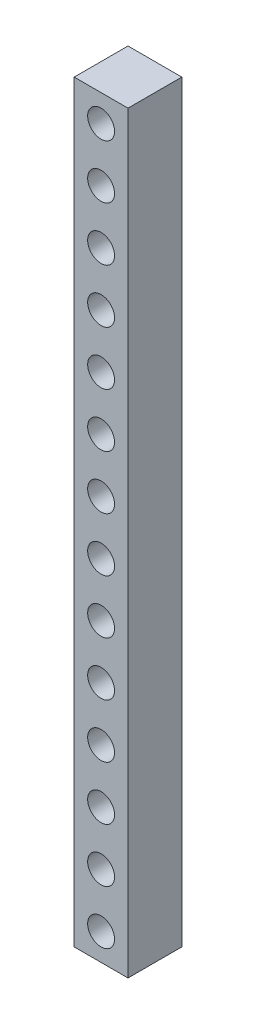
ISO-10303-21;
HEADER;
FILE_DESCRIPTION(('STEP AP214'),'2;1');
FILE_NAME('part.step','',(''),(''),'','','');
FILE_SCHEMA(('AUTOMOTIVE_DESIGN { 1 0 10303 214 1 1 1 1 }'));
ENDSEC;
DATA;
#1=APPLICATION_CONTEXT('core data for automotive mechanical design processes');
#2=APPLICATION_PROTOCOL_DEFINITION('international standard','automotive_design',2000,#1);
#3=PRODUCT_CONTEXT('',#1,'mechanical');
#4=PRODUCT('Part','Part','',(#3));
#5=PRODUCT_RELATED_PRODUCT_CATEGORY('part','',(#4));
#6=PRODUCT_DEFINITION_FORMATION('','',#4);
#7=PRODUCT_DEFINITION_CONTEXT('part definition',#1,'design');
#8=PRODUCT_DEFINITION('design','',#6,#7);
#9=PRODUCT_DEFINITION_SHAPE('','',#8);
#10=(LENGTH_UNIT() NAMED_UNIT(*) SI_UNIT(.MILLI.,.METRE.));
#11=(NAMED_UNIT(*) PLANE_ANGLE_UNIT() SI_UNIT($,.RADIAN.));
#12=(NAMED_UNIT(*) SI_UNIT($,.STERADIAN.) SOLID_ANGLE_UNIT());
#13=UNCERTAINTY_MEASURE_WITH_UNIT(LENGTH_MEASURE(1.E-05),#10,'distance_accuracy_value','');
#14=(GEOMETRIC_REPRESENTATION_CONTEXT(3) GLOBAL_UNCERTAINTY_ASSIGNED_CONTEXT((#13)) GLOBAL_UNIT_ASSIGNED_CONTEXT((#10,
#11,#12)) REPRESENTATION_CONTEXT('',''));
#15=CARTESIAN_POINT('',(0.,0.,0.));
#16=DIRECTION('',(0.,0.,1.));
#17=DIRECTION('',(1.,0.,0.));
#18=AXIS2_PLACEMENT_3D('',#15,#16,#17);
#19=CARTESIAN_POINT('',(0.,0.,10.));
#20=DIRECTION('',(0.,0.,-1.));
#21=DIRECTION('',(-1.,0.,0.));
#22=AXIS2_PLACEMENT_3D('',#19,#20,#21);
#23=PLANE('',#22);
#24=DIRECTION('',(0.,-1.,0.));
#25=VECTOR('',#24,1.);
#26=CARTESIAN_POINT('',(-5.,69.9999999999998,10.));
#27=LINE('',#26,#25);
#28=CARTESIAN_POINT('',(-5.,69.9999999999998,10.));
#29=VERTEX_POINT('',#28);
#30=CARTESIAN_POINT('',(-5.00000000000004,-70.0000000000002,10.));
#31=VERTEX_POINT('',#30);
#32=EDGE_CURVE('E85',#29,#31,#27,.T.);
#33=ORIENTED_EDGE('',*,*,#32,.T.);
#34=DIRECTION('',(1.,0.,0.));
#35=VECTOR('',#34,1.);
#36=CARTESIAN_POINT('',(5.00000000000008,-70.0000000000002,10.));
#37=LINE('',#36,#35);
#38=CARTESIAN_POINT('',(5.00000000000008,-70.0000000000002,10.));
#39=VERTEX_POINT('',#38);
#40=EDGE_CURVE('E80',#31,#39,#37,.T.);
#41=ORIENTED_EDGE('',*,*,#40,.T.);
#42=DIRECTION('',(0.,1.,0.));
#43=VECTOR('',#42,1.);
#44=CARTESIAN_POINT('',(5.,69.9999999999998,10.));
#45=LINE('',#44,#43);
#46=CARTESIAN_POINT('',(5.,69.9999999999998,10.));
#47=VERTEX_POINT('',#46);
#48=EDGE_CURVE('E83',#39,#47,#45,.T.);
#49=ORIENTED_EDGE('',*,*,#48,.T.);
#50=DIRECTION('',(-1.,0.,0.));
#51=VECTOR('',#50,1.);
#52=CARTESIAN_POINT('',(5.,69.9999999999998,10.));
#53=LINE('',#52,#51);
#54=EDGE_CURVE('E50',#47,#29,#53,.T.);
#55=ORIENTED_EDGE('',*,*,#54,.T.);
#56=EDGE_LOOP('',(#33,#41,#49,#55));
#57=FACE_BOUND('',#56,.T.);
#58=CARTESIAN_POINT('',(0.,64.9999999999998,10.));
#59=DIRECTION('',(0.,0.,1.));
#60=DIRECTION('',(1.,0.,0.));
#61=AXIS2_PLACEMENT_3D('',#58,#59,#60);
#62=CIRCLE('',#61,2.5);
#63=CARTESIAN_POINT('',(2.50000000000001,64.9999999999998,10.));
#64=VERTEX_POINT('',#63);
#65=EDGE_CURVE('E100',#64,#64,#62,.T.);
#66=ORIENTED_EDGE('',*,*,#65,.F.);
#67=EDGE_LOOP('',(#66));
#68=FACE_BOUND('',#67,.T.);
#69=CARTESIAN_POINT('',(1.09081248855236E-13,54.9999999999998,10.));
#70=DIRECTION('',(0.,0.,1.));
#71=DIRECTION('',(1.,0.,0.));
#72=AXIS2_PLACEMENT_3D('',#69,#70,#71);
#73=CIRCLE('',#72,2.5);
#74=CARTESIAN_POINT('',(2.50000000000011,54.9999999999998,10.));
#75=VERTEX_POINT('',#74);
#76=EDGE_CURVE('E115',#75,#75,#73,.T.);
#77=ORIENTED_EDGE('',*,*,#76,.F.);
#78=EDGE_LOOP('',(#77));
#79=FACE_BOUND('',#78,.T.);
#80=CARTESIAN_POINT('',(2.1382568902053E-13,44.9999999999998,10.));
#81=DIRECTION('',(0.,0.,1.));
#82=DIRECTION('',(1.,0.,0.));
#83=AXIS2_PLACEMENT_3D('',#80,#81,#82);
#84=CIRCLE('',#83,2.5);
#85=CARTESIAN_POINT('',(2.50000000000022,44.9999999999998,10.));
#86=VERTEX_POINT('',#85);
#87=EDGE_CURVE('E121',#86,#86,#84,.T.);
#88=ORIENTED_EDGE('',*,*,#87,.F.);
#89=EDGE_LOOP('',(#88));
#90=FACE_BOUND('',#89,.T.);
#91=CARTESIAN_POINT('',(3.18570129185824E-13,34.9999999999998,10.));
#92=DIRECTION('',(0.,0.,1.));
#93=DIRECTION('',(1.,0.,0.));
#94=AXIS2_PLACEMENT_3D('',#91,#92,#93);
#95=CIRCLE('',#94,2.5);
#96=CARTESIAN_POINT('',(2.50000000000032,34.9999999999998,10.));
#97=VERTEX_POINT('',#96);
#98=EDGE_CURVE('E127',#97,#97,#95,.T.);
#99=ORIENTED_EDGE('',*,*,#98,.F.);
#100=EDGE_LOOP('',(#99));
#101=FACE_BOUND('',#100,.T.);
#102=CARTESIAN_POINT('',(4.23314569351118E-13,24.9999999999998,10.));
#103=DIRECTION('',(0.,0.,1.));
#104=DIRECTION('',(1.,0.,0.));
#105=AXIS2_PLACEMENT_3D('',#102,#103,#104);
#106=CIRCLE('',#105,2.5);
#107=CARTESIAN_POINT('',(2.50000000000042,24.9999999999998,10.));
#108=VERTEX_POINT('',#107);
#109=EDGE_CURVE('E133',#108,#108,#106,.T.);
#110=ORIENTED_EDGE('',*,*,#109,.F.);
#111=EDGE_LOOP('',(#110));
#112=FACE_BOUND('',#111,.T.);
#113=CARTESIAN_POINT('',(5.28059009516412E-13,14.9999999999998,10.));
#114=DIRECTION('',(0.,0.,1.));
#115=DIRECTION('',(1.,0.,0.));
#116=AXIS2_PLACEMENT_3D('',#113,#114,#115);
#117=CIRCLE('',#116,2.5);
#118=CARTESIAN_POINT('',(2.50000000000053,14.9999999999998,10.));
#119=VERTEX_POINT('',#118);
#120=EDGE_CURVE('E139',#119,#119,#117,.T.);
#121=ORIENTED_EDGE('',*,*,#120,.F.);
#122=EDGE_LOOP('',(#121));
#123=FACE_BOUND('',#122,.T.);
#124=CARTESIAN_POINT('',(6.32803449681706E-13,4.99999999999985,10.));
#125=DIRECTION('',(0.,0.,1.));
#126=DIRECTION('',(1.,0.,0.));
#127=AXIS2_PLACEMENT_3D('',#124,#125,#126);
#128=CIRCLE('',#127,2.5);
#129=CARTESIAN_POINT('',(2.50000000000063,4.99999999999985,10.));
#130=VERTEX_POINT('',#129);
#131=EDGE_CURVE('E145',#130,#130,#128,.T.);
#132=ORIENTED_EDGE('',*,*,#131,.F.);
#133=EDGE_LOOP('',(#132));
#134=FACE_BOUND('',#133,.T.);
#135=CARTESIAN_POINT('',(7.37547889847E-13,-5.00000000000014,10.));
#136=DIRECTION('',(0.,0.,1.));
#137=DIRECTION('',(1.,0.,0.));
#138=AXIS2_PLACEMENT_3D('',#135,#136,#137);
#139=CIRCLE('',#138,2.5);
#140=CARTESIAN_POINT('',(2.50000000000074,-5.00000000000014,10.));
#141=VERTEX_POINT('',#140);
#142=EDGE_CURVE('E151',#141,#141,#139,.T.);
#143=ORIENTED_EDGE('',*,*,#142,.F.);
#144=EDGE_LOOP('',(#143));
#145=FACE_BOUND('',#144,.T.);
#146=CARTESIAN_POINT('',(8.42292330012294E-13,-15.0000000000001,10.));
#147=DIRECTION('',(0.,0.,1.));
#148=DIRECTION('',(1.,0.,0.));
#149=AXIS2_PLACEMENT_3D('',#146,#147,#148);
#150=CIRCLE('',#149,2.5);
#151=CARTESIAN_POINT('',(2.50000000000084,-15.0000000000001,10.));
#152=VERTEX_POINT('',#151);
#153=EDGE_CURVE('E157',#152,#152,#150,.T.);
#154=ORIENTED_EDGE('',*,*,#153,.F.);
#155=EDGE_LOOP('',(#154));
#156=FACE_BOUND('',#155,.T.);
#157=CARTESIAN_POINT('',(9.47036770177587E-13,-25.0000000000001,10.));
#158=DIRECTION('',(0.,0.,1.));
#159=DIRECTION('',(1.,0.,0.));
#160=AXIS2_PLACEMENT_3D('',#157,#158,#159);
#161=CIRCLE('',#160,2.5);
#162=CARTESIAN_POINT('',(2.50000000000095,-25.0000000000001,10.));
#163=VERTEX_POINT('',#162);
#164=EDGE_CURVE('E163',#163,#163,#161,.T.);
#165=ORIENTED_EDGE('',*,*,#164,.F.);
#166=EDGE_LOOP('',(#165));
#167=FACE_BOUND('',#166,.T.);
#168=CARTESIAN_POINT('',(1.05178121034288E-12,-35.0000000000001,10.));
#169=DIRECTION('',(0.,0.,1.));
#170=DIRECTION('',(1.,0.,0.));
#171=AXIS2_PLACEMENT_3D('',#168,#169,#170);
#172=CIRCLE('',#171,2.5);
#173=CARTESIAN_POINT('',(2.50000000000105,-35.0000000000001,10.));
#174=VERTEX_POINT('',#173);
#175=EDGE_CURVE('E169',#174,#174,#172,.T.);
#176=ORIENTED_EDGE('',*,*,#175,.F.);
#177=EDGE_LOOP('',(#176));
#178=FACE_BOUND('',#177,.T.);
#179=CARTESIAN_POINT('',(1.15652565050818E-12,-45.0000000000001,10.));
#180=DIRECTION('',(0.,0.,1.));
#181=DIRECTION('',(1.,0.,0.));
#182=AXIS2_PLACEMENT_3D('',#179,#180,#181);
#183=CIRCLE('',#182,2.5);
#184=CARTESIAN_POINT('',(2.50000000000116,-45.0000000000001,10.));
#185=VERTEX_POINT('',#184);
#186=EDGE_CURVE('E175',#185,#185,#183,.T.);
#187=ORIENTED_EDGE('',*,*,#186,.F.);
#188=EDGE_LOOP('',(#187));
#189=FACE_BOUND('',#188,.T.);
#190=CARTESIAN_POINT('',(1.26127009067347E-12,-55.0000000000001,10.));
#191=DIRECTION('',(0.,0.,1.));
#192=DIRECTION('',(1.,0.,0.));
#193=AXIS2_PLACEMENT_3D('',#190,#191,#192);
#194=CIRCLE('',#193,2.5);
#195=CARTESIAN_POINT('',(2.50000000000126,-55.0000000000001,10.));
#196=VERTEX_POINT('',#195);
#197=EDGE_CURVE('E181',#196,#196,#194,.T.);
#198=ORIENTED_EDGE('',*,*,#197,.F.);
#199=EDGE_LOOP('',(#198));
#200=FACE_BOUND('',#199,.T.);
#201=CARTESIAN_POINT('',(1.36601453083876E-12,-65.0000000000001,10.));
#202=DIRECTION('',(0.,0.,1.));
#203=DIRECTION('',(1.,0.,0.));
#204=AXIS2_PLACEMENT_3D('',#201,#202,#203);
#205=CIRCLE('',#204,2.5);
#206=CARTESIAN_POINT('',(2.50000000000137,-65.0000000000001,10.));
#207=VERTEX_POINT('',#206);
#208=EDGE_CURVE('E187',#207,#207,#205,.T.);
#209=ORIENTED_EDGE('',*,*,#208,.F.);
#210=EDGE_LOOP('',(#209));
#211=FACE_BOUND('',#210,.T.);
#212=ADVANCED_FACE('F33',(#57,#68,#79,#90,#101,#112,#123,#134,#145,#156,#167,#178,#189,#200,
#211),#23,.F.);
#213=CARTESIAN_POINT('',(0.,0.,0.));
#214=DIRECTION('',(0.,0.,-1.));
#215=DIRECTION('',(-1.,0.,0.));
#216=AXIS2_PLACEMENT_3D('',#213,#214,#215);
#217=PLANE('',#216);
#218=CARTESIAN_POINT('',(1.26127009067347E-12,-55.0000000000001,0.));
#219=DIRECTION('',(0.,0.,1.));
#220=DIRECTION('',(1.,0.,0.));
#221=AXIS2_PLACEMENT_3D('',#218,#219,#220);
#222=CIRCLE('',#221,2.5);
#223=CARTESIAN_POINT('',(2.50000000000126,-55.0000000000001,0.));
#224=VERTEX_POINT('',#223);
#225=EDGE_CURVE('E184',#224,#224,#222,.T.);
#226=ORIENTED_EDGE('',*,*,#225,.T.);
#227=EDGE_LOOP('',(#226));
#228=FACE_BOUND('',#227,.T.);
#229=CARTESIAN_POINT('',(1.05178121034288E-12,-35.0000000000001,0.));
#230=DIRECTION('',(0.,0.,1.));
#231=DIRECTION('',(1.,0.,0.));
#232=AXIS2_PLACEMENT_3D('',#229,#230,#231);
#233=CIRCLE('',#232,2.5);
#234=CARTESIAN_POINT('',(2.50000000000105,-35.0000000000001,0.));
#235=VERTEX_POINT('',#234);
#236=EDGE_CURVE('E172',#235,#235,#233,.T.);
#237=ORIENTED_EDGE('',*,*,#236,.T.);
#238=EDGE_LOOP('',(#237));
#239=FACE_BOUND('',#238,.T.);
#240=CARTESIAN_POINT('',(8.42292330012294E-13,-15.0000000000001,0.));
#241=DIRECTION('',(0.,0.,1.));
#242=DIRECTION('',(1.,0.,0.));
#243=AXIS2_PLACEMENT_3D('',#240,#241,#242);
#244=CIRCLE('',#243,2.5);
#245=CARTESIAN_POINT('',(2.50000000000084,-15.0000000000001,0.));
#246=VERTEX_POINT('',#245);
#247=EDGE_CURVE('E160',#246,#246,#244,.T.);
#248=ORIENTED_EDGE('',*,*,#247,.T.);
#249=EDGE_LOOP('',(#248));
#250=FACE_BOUND('',#249,.T.);
#251=CARTESIAN_POINT('',(6.32803449681706E-13,4.99999999999985,0.));
#252=DIRECTION('',(0.,0.,1.));
#253=DIRECTION('',(1.,0.,0.));
#254=AXIS2_PLACEMENT_3D('',#251,#252,#253);
#255=CIRCLE('',#254,2.5);
#256=CARTESIAN_POINT('',(2.50000000000063,4.99999999999985,0.));
#257=VERTEX_POINT('',#256);
#258=EDGE_CURVE('E148',#257,#257,#255,.T.);
#259=ORIENTED_EDGE('',*,*,#258,.T.);
#260=EDGE_LOOP('',(#259));
#261=FACE_BOUND('',#260,.T.);
#262=CARTESIAN_POINT('',(4.23314569351118E-13,24.9999999999998,0.));
#263=DIRECTION('',(0.,0.,1.));
#264=DIRECTION('',(1.,0.,0.));
#265=AXIS2_PLACEMENT_3D('',#262,#263,#264);
#266=CIRCLE('',#265,2.5);
#267=CARTESIAN_POINT('',(2.50000000000042,24.9999999999998,0.));
#268=VERTEX_POINT('',#267);
#269=EDGE_CURVE('E136',#268,#268,#266,.T.);
#270=ORIENTED_EDGE('',*,*,#269,.T.);
#271=EDGE_LOOP('',(#270));
#272=FACE_BOUND('',#271,.T.);
#273=CARTESIAN_POINT('',(2.1382568902053E-13,44.9999999999998,0.));
#274=DIRECTION('',(0.,0.,1.));
#275=DIRECTION('',(1.,0.,0.));
#276=AXIS2_PLACEMENT_3D('',#273,#274,#275);
#277=CIRCLE('',#276,2.5);
#278=CARTESIAN_POINT('',(2.50000000000022,44.9999999999998,0.));
#279=VERTEX_POINT('',#278);
#280=EDGE_CURVE('E124',#279,#279,#277,.T.);
#281=ORIENTED_EDGE('',*,*,#280,.T.);
#282=EDGE_LOOP('',(#281));
#283=FACE_BOUND('',#282,.T.);
#284=CARTESIAN_POINT('',(0.,64.9999999999998,0.));
#285=DIRECTION('',(0.,0.,1.));
#286=DIRECTION('',(1.,0.,0.));
#287=AXIS2_PLACEMENT_3D('',#284,#285,#286);
#288=CIRCLE('',#287,2.5);
#289=CARTESIAN_POINT('',(2.50000000000001,64.9999999999998,0.));
#290=VERTEX_POINT('',#289);
#291=EDGE_CURVE('E112',#290,#290,#288,.T.);
#292=ORIENTED_EDGE('',*,*,#291,.T.);
#293=EDGE_LOOP('',(#292));
#294=FACE_BOUND('',#293,.T.);
#295=DIRECTION('',(0.,-1.,0.));
#296=VECTOR('',#295,1.);
#297=CARTESIAN_POINT('',(-5.,69.9999999999998,0.));
#298=LINE('',#297,#296);
#299=CARTESIAN_POINT('',(-5.,69.9999999999998,0.));
#300=VERTEX_POINT('',#299);
#301=CARTESIAN_POINT('',(-5.00000000000004,-70.0000000000002,0.));
#302=VERTEX_POINT('',#301);
#303=EDGE_CURVE('E97',#300,#302,#298,.T.);
#304=ORIENTED_EDGE('',*,*,#303,.F.);
#305=DIRECTION('',(-1.,0.,0.));
#306=VECTOR('',#305,1.);
#307=CARTESIAN_POINT('',(5.,69.9999999999998,0.));
#308=LINE('',#307,#306);
#309=CARTESIAN_POINT('',(5.,69.9999999999998,0.));
#310=VERTEX_POINT('',#309);
#311=EDGE_CURVE('E73',#310,#300,#308,.T.);
#312=ORIENTED_EDGE('',*,*,#311,.F.);
#313=DIRECTION('',(0.,1.,0.));
#314=VECTOR('',#313,1.);
#315=CARTESIAN_POINT('',(5.,69.9999999999998,0.));
#316=LINE('',#315,#314);
#317=CARTESIAN_POINT('',(5.00000000000008,-70.0000000000002,0.));
#318=VERTEX_POINT('',#317);
#319=EDGE_CURVE('E67',#318,#310,#316,.T.);
#320=ORIENTED_EDGE('',*,*,#319,.F.);
#321=DIRECTION('',(1.,0.,0.));
#322=VECTOR('',#321,1.);
#323=CARTESIAN_POINT('',(5.00000000000008,-70.0000000000002,0.));
#324=LINE('',#323,#322);
#325=EDGE_CURVE('E89',#302,#318,#324,.T.);
#326=ORIENTED_EDGE('',*,*,#325,.F.);
#327=EDGE_LOOP('',(#304,#312,#320,#326));
#328=FACE_BOUND('',#327,.T.);
#329=CARTESIAN_POINT('',(1.09081248855236E-13,54.9999999999998,0.));
#330=DIRECTION('',(0.,0.,1.));
#331=DIRECTION('',(1.,0.,0.));
#332=AXIS2_PLACEMENT_3D('',#329,#330,#331);
#333=CIRCLE('',#332,2.5);
#334=CARTESIAN_POINT('',(2.50000000000011,54.9999999999998,0.));
#335=VERTEX_POINT('',#334);
#336=EDGE_CURVE('E118',#335,#335,#333,.T.);
#337=ORIENTED_EDGE('',*,*,#336,.T.);
#338=EDGE_LOOP('',(#337));
#339=FACE_BOUND('',#338,.T.);
#340=CARTESIAN_POINT('',(3.18570129185824E-13,34.9999999999998,0.));
#341=DIRECTION('',(0.,0.,1.));
#342=DIRECTION('',(1.,0.,0.));
#343=AXIS2_PLACEMENT_3D('',#340,#341,#342);
#344=CIRCLE('',#343,2.5);
#345=CARTESIAN_POINT('',(2.50000000000032,34.9999999999998,0.));
#346=VERTEX_POINT('',#345);
#347=EDGE_CURVE('E130',#346,#346,#344,.T.);
#348=ORIENTED_EDGE('',*,*,#347,.T.);
#349=EDGE_LOOP('',(#348));
#350=FACE_BOUND('',#349,.T.);
#351=CARTESIAN_POINT('',(5.28059009516412E-13,14.9999999999998,0.));
#352=DIRECTION('',(0.,0.,1.));
#353=DIRECTION('',(1.,0.,0.));
#354=AXIS2_PLACEMENT_3D('',#351,#352,#353);
#355=CIRCLE('',#354,2.5);
#356=CARTESIAN_POINT('',(2.50000000000053,14.9999999999998,0.));
#357=VERTEX_POINT('',#356);
#358=EDGE_CURVE('E142',#357,#357,#355,.T.);
#359=ORIENTED_EDGE('',*,*,#358,.T.);
#360=EDGE_LOOP('',(#359));
#361=FACE_BOUND('',#360,.T.);
#362=CARTESIAN_POINT('',(7.37547889847E-13,-5.00000000000014,0.));
#363=DIRECTION('',(0.,0.,1.));
#364=DIRECTION('',(1.,0.,0.));
#365=AXIS2_PLACEMENT_3D('',#362,#363,#364);
#366=CIRCLE('',#365,2.5);
#367=CARTESIAN_POINT('',(2.50000000000074,-5.00000000000014,0.));
#368=VERTEX_POINT('',#367);
#369=EDGE_CURVE('E154',#368,#368,#366,.T.);
#370=ORIENTED_EDGE('',*,*,#369,.T.);
#371=EDGE_LOOP('',(#370));
#372=FACE_BOUND('',#371,.T.);
#373=CARTESIAN_POINT('',(9.47036770177587E-13,-25.0000000000001,0.));
#374=DIRECTION('',(0.,0.,1.));
#375=DIRECTION('',(1.,0.,0.));
#376=AXIS2_PLACEMENT_3D('',#373,#374,#375);
#377=CIRCLE('',#376,2.5);
#378=CARTESIAN_POINT('',(2.50000000000095,-25.0000000000001,0.));
#379=VERTEX_POINT('',#378);
#380=EDGE_CURVE('E166',#379,#379,#377,.T.);
#381=ORIENTED_EDGE('',*,*,#380,.T.);
#382=EDGE_LOOP('',(#381));
#383=FACE_BOUND('',#382,.T.);
#384=CARTESIAN_POINT('',(1.15652565050818E-12,-45.0000000000001,0.));
#385=DIRECTION('',(0.,0.,1.));
#386=DIRECTION('',(1.,0.,0.));
#387=AXIS2_PLACEMENT_3D('',#384,#385,#386);
#388=CIRCLE('',#387,2.5);
#389=CARTESIAN_POINT('',(2.50000000000116,-45.0000000000001,0.));
#390=VERTEX_POINT('',#389);
#391=EDGE_CURVE('E178',#390,#390,#388,.T.);
#392=ORIENTED_EDGE('',*,*,#391,.T.);
#393=EDGE_LOOP('',(#392));
#394=FACE_BOUND('',#393,.T.);
#395=CARTESIAN_POINT('',(1.36601453083876E-12,-65.0000000000001,0.));
#396=DIRECTION('',(0.,0.,1.));
#397=DIRECTION('',(1.,0.,0.));
#398=AXIS2_PLACEMENT_3D('',#395,#396,#397);
#399=CIRCLE('',#398,2.5);
#400=CARTESIAN_POINT('',(2.50000000000137,-65.0000000000001,0.));
#401=VERTEX_POINT('',#400);
#402=EDGE_CURVE('E190',#401,#401,#399,.T.);
#403=ORIENTED_EDGE('',*,*,#402,.T.);
#404=EDGE_LOOP('',(#403));
#405=FACE_BOUND('',#404,.T.);
#406=ADVANCED_FACE('F108',(#228,#239,#250,#261,#272,#283,#294,#328,#339,#350,#361,#372,#383,
#394,#405),#217,.T.);
#407=CARTESIAN_POINT('',(-5.,69.9999999999998,10.));
#408=DIRECTION('',(1.,0.,0.));
#409=DIRECTION('',(0.,1.,0.));
#410=AXIS2_PLACEMENT_3D('',#407,#408,#409);
#411=PLANE('',#410);
#412=ORIENTED_EDGE('',*,*,#303,.T.);
#413=DIRECTION('',(0.,0.,-1.));
#414=VECTOR('',#413,1.);
#415=CARTESIAN_POINT('',(-5.00000000000004,-70.0000000000002,10.));
#416=LINE('',#415,#414);
#417=EDGE_CURVE('E11',#31,#302,#416,.T.);
#418=ORIENTED_EDGE('',*,*,#417,.F.);
#419=ORIENTED_EDGE('',*,*,#32,.F.);
#420=DIRECTION('',(0.,0.,-1.));
#421=VECTOR('',#420,1.);
#422=CARTESIAN_POINT('',(-5.,69.9999999999998,10.));
#423=LINE('',#422,#421);
#424=EDGE_CURVE('E93',#29,#300,#423,.T.);
#425=ORIENTED_EDGE('',*,*,#424,.T.);
#426=EDGE_LOOP('',(#412,#418,#419,#425));
#427=FACE_BOUND('',#426,.T.);
#428=ADVANCED_FACE('F35',(#427),#411,.F.);
#429=CARTESIAN_POINT('',(5.00000000000008,-70.0000000000002,10.));
#430=DIRECTION('',(0.,1.,0.));
#431=DIRECTION('',(0.,0.,1.));
#432=AXIS2_PLACEMENT_3D('',#429,#430,#431);
#433=PLANE('',#432);
#434=ORIENTED_EDGE('',*,*,#325,.T.);
#435=DIRECTION('',(0.,0.,-1.));
#436=VECTOR('',#435,1.);
#437=CARTESIAN_POINT('',(5.00000000000008,-70.0000000000002,10.));
#438=LINE('',#437,#436);
#439=EDGE_CURVE('E42',#39,#318,#438,.T.);
#440=ORIENTED_EDGE('',*,*,#439,.F.);
#441=ORIENTED_EDGE('',*,*,#40,.F.);
#442=ORIENTED_EDGE('',*,*,#417,.T.);
#443=EDGE_LOOP('',(#434,#440,#441,#442));
#444=FACE_BOUND('',#443,.T.);
#445=ADVANCED_FACE('F88',(#444),#433,.F.);
#446=CARTESIAN_POINT('',(5.,69.9999999999998,10.));
#447=DIRECTION('',(-1.,0.,0.));
#448=DIRECTION('',(0.,-1.,0.));
#449=AXIS2_PLACEMENT_3D('',#446,#447,#448);
#450=PLANE('',#449);
#451=ORIENTED_EDGE('',*,*,#319,.T.);
#452=DIRECTION('',(0.,0.,-1.));
#453=VECTOR('',#452,1.);
#454=CARTESIAN_POINT('',(5.,69.9999999999998,10.));
#455=LINE('',#454,#453);
#456=EDGE_CURVE('E90',#47,#310,#455,.T.);
#457=ORIENTED_EDGE('',*,*,#456,.F.);
#458=ORIENTED_EDGE('',*,*,#48,.F.);
#459=ORIENTED_EDGE('',*,*,#439,.T.);
#460=EDGE_LOOP('',(#451,#457,#458,#459));
#461=FACE_BOUND('',#460,.T.);
#462=ADVANCED_FACE('F91',(#461),#450,.F.);
#463=CARTESIAN_POINT('',(5.,69.9999999999998,10.));
#464=DIRECTION('',(0.,-1.,0.));
#465=DIRECTION('',(1.,0.,0.));
#466=AXIS2_PLACEMENT_3D('',#463,#464,#465);
#467=PLANE('',#466);
#468=ORIENTED_EDGE('',*,*,#311,.T.);
#469=ORIENTED_EDGE('',*,*,#424,.F.);
#470=ORIENTED_EDGE('',*,*,#54,.F.);
#471=ORIENTED_EDGE('',*,*,#456,.T.);
#472=EDGE_LOOP('',(#468,#469,#470,#471));
#473=FACE_BOUND('',#472,.T.);
#474=ADVANCED_FACE('F105',(#473),#467,.F.);
#475=CARTESIAN_POINT('',(0.,64.9999999999998,10.));
#476=DIRECTION('',(0.,0.,-1.));
#477=DIRECTION('',(-1.,0.,0.));
#478=AXIS2_PLACEMENT_3D('',#475,#476,#477);
#479=CYLINDRICAL_SURFACE('',#478,2.5);
#480=ORIENTED_EDGE('',*,*,#65,.T.);
#481=EDGE_LOOP('',(#480));
#482=FACE_BOUND('',#481,.T.);
#483=ORIENTED_EDGE('',*,*,#291,.F.);
#484=EDGE_LOOP('',(#483));
#485=FACE_BOUND('',#484,.T.);
#486=ADVANCED_FACE('F207',(#482,#485),#479,.F.);
#487=CARTESIAN_POINT('',(1.09081248855236E-13,54.9999999999998,10.));
#488=DIRECTION('',(0.,0.,-1.));
#489=DIRECTION('',(-1.,0.,0.));
#490=AXIS2_PLACEMENT_3D('',#487,#488,#489);
#491=CYLINDRICAL_SURFACE('',#490,2.5);
#492=ORIENTED_EDGE('',*,*,#76,.T.);
#493=EDGE_LOOP('',(#492));
#494=FACE_BOUND('',#493,.T.);
#495=ORIENTED_EDGE('',*,*,#336,.F.);
#496=EDGE_LOOP('',(#495));
#497=FACE_BOUND('',#496,.T.);
#498=ADVANCED_FACE('F253',(#494,#497),#491,.F.);
#499=CARTESIAN_POINT('',(2.1382568902053E-13,44.9999999999998,10.));
#500=DIRECTION('',(0.,0.,-1.));
#501=DIRECTION('',(-1.,0.,0.));
#502=AXIS2_PLACEMENT_3D('',#499,#500,#501);
#503=CYLINDRICAL_SURFACE('',#502,2.5);
#504=ORIENTED_EDGE('',*,*,#87,.T.);
#505=EDGE_LOOP('',(#504));
#506=FACE_BOUND('',#505,.T.);
#507=ORIENTED_EDGE('',*,*,#280,.F.);
#508=EDGE_LOOP('',(#507));
#509=FACE_BOUND('',#508,.T.);
#510=ADVANCED_FACE('F261',(#506,#509),#503,.F.);
#511=CARTESIAN_POINT('',(3.18570129185824E-13,34.9999999999998,10.));
#512=DIRECTION('',(0.,0.,-1.));
#513=DIRECTION('',(-1.,0.,0.));
#514=AXIS2_PLACEMENT_3D('',#511,#512,#513);
#515=CYLINDRICAL_SURFACE('',#514,2.5);
#516=ORIENTED_EDGE('',*,*,#98,.T.);
#517=EDGE_LOOP('',(#516));
#518=FACE_BOUND('',#517,.T.);
#519=ORIENTED_EDGE('',*,*,#347,.F.);
#520=EDGE_LOOP('',(#519));
#521=FACE_BOUND('',#520,.T.);
#522=ADVANCED_FACE('F269',(#518,#521),#515,.F.);
#523=CARTESIAN_POINT('',(4.23314569351118E-13,24.9999999999998,10.));
#524=DIRECTION('',(0.,0.,-1.));
#525=DIRECTION('',(-1.,0.,0.));
#526=AXIS2_PLACEMENT_3D('',#523,#524,#525);
#527=CYLINDRICAL_SURFACE('',#526,2.5);
#528=ORIENTED_EDGE('',*,*,#109,.T.);
#529=EDGE_LOOP('',(#528));
#530=FACE_BOUND('',#529,.T.);
#531=ORIENTED_EDGE('',*,*,#269,.F.);
#532=EDGE_LOOP('',(#531));
#533=FACE_BOUND('',#532,.T.);
#534=ADVANCED_FACE('F278',(#530,#533),#527,.F.);
#535=CARTESIAN_POINT('',(5.28059009516412E-13,14.9999999999998,10.));
#536=DIRECTION('',(0.,0.,-1.));
#537=DIRECTION('',(-1.,0.,0.));
#538=AXIS2_PLACEMENT_3D('',#535,#536,#537);
#539=CYLINDRICAL_SURFACE('',#538,2.5);
#540=ORIENTED_EDGE('',*,*,#120,.T.);
#541=EDGE_LOOP('',(#540));
#542=FACE_BOUND('',#541,.T.);
#543=ORIENTED_EDGE('',*,*,#358,.F.);
#544=EDGE_LOOP('',(#543));
#545=FACE_BOUND('',#544,.T.);
#546=ADVANCED_FACE('F287',(#542,#545),#539,.F.);
#547=CARTESIAN_POINT('',(6.32803449681706E-13,4.99999999999985,10.));
#548=DIRECTION('',(0.,0.,-1.));
#549=DIRECTION('',(-1.,0.,0.));
#550=AXIS2_PLACEMENT_3D('',#547,#548,#549);
#551=CYLINDRICAL_SURFACE('',#550,2.5);
#552=ORIENTED_EDGE('',*,*,#131,.T.);
#553=EDGE_LOOP('',(#552));
#554=FACE_BOUND('',#553,.T.);
#555=ORIENTED_EDGE('',*,*,#258,.F.);
#556=EDGE_LOOP('',(#555));
#557=FACE_BOUND('',#556,.T.);
#558=ADVANCED_FACE('F296',(#554,#557),#551,.F.);
#559=CARTESIAN_POINT('',(7.37547889847E-13,-5.00000000000014,10.));
#560=DIRECTION('',(0.,0.,-1.));
#561=DIRECTION('',(-1.,0.,0.));
#562=AXIS2_PLACEMENT_3D('',#559,#560,#561);
#563=CYLINDRICAL_SURFACE('',#562,2.5);
#564=ORIENTED_EDGE('',*,*,#142,.T.);
#565=EDGE_LOOP('',(#564));
#566=FACE_BOUND('',#565,.T.);
#567=ORIENTED_EDGE('',*,*,#369,.F.);
#568=EDGE_LOOP('',(#567));
#569=FACE_BOUND('',#568,.T.);
#570=ADVANCED_FACE('F305',(#566,#569),#563,.F.);
#571=CARTESIAN_POINT('',(8.42292330012294E-13,-15.0000000000001,10.));
#572=DIRECTION('',(0.,0.,-1.));
#573=DIRECTION('',(-1.,0.,0.));
#574=AXIS2_PLACEMENT_3D('',#571,#572,#573);
#575=CYLINDRICAL_SURFACE('',#574,2.5);
#576=ORIENTED_EDGE('',*,*,#153,.T.);
#577=EDGE_LOOP('',(#576));
#578=FACE_BOUND('',#577,.T.);
#579=ORIENTED_EDGE('',*,*,#247,.F.);
#580=EDGE_LOOP('',(#579));
#581=FACE_BOUND('',#580,.T.);
#582=ADVANCED_FACE('F314',(#578,#581),#575,.F.);
#583=CARTESIAN_POINT('',(9.47036770177587E-13,-25.0000000000001,10.));
#584=DIRECTION('',(0.,0.,-1.));
#585=DIRECTION('',(-1.,0.,0.));
#586=AXIS2_PLACEMENT_3D('',#583,#584,#585);
#587=CYLINDRICAL_SURFACE('',#586,2.5);
#588=ORIENTED_EDGE('',*,*,#164,.T.);
#589=EDGE_LOOP('',(#588));
#590=FACE_BOUND('',#589,.T.);
#591=ORIENTED_EDGE('',*,*,#380,.F.);
#592=EDGE_LOOP('',(#591));
#593=FACE_BOUND('',#592,.T.);
#594=ADVANCED_FACE('F323',(#590,#593),#587,.F.);
#595=CARTESIAN_POINT('',(1.05178121034288E-12,-35.0000000000001,10.));
#596=DIRECTION('',(0.,0.,-1.));
#597=DIRECTION('',(-1.,0.,0.));
#598=AXIS2_PLACEMENT_3D('',#595,#596,#597);
#599=CYLINDRICAL_SURFACE('',#598,2.5);
#600=ORIENTED_EDGE('',*,*,#175,.T.);
#601=EDGE_LOOP('',(#600));
#602=FACE_BOUND('',#601,.T.);
#603=ORIENTED_EDGE('',*,*,#236,.F.);
#604=EDGE_LOOP('',(#603));
#605=FACE_BOUND('',#604,.T.);
#606=ADVANCED_FACE('F332',(#602,#605),#599,.F.);
#607=CARTESIAN_POINT('',(1.15652565050818E-12,-45.0000000000001,10.));
#608=DIRECTION('',(0.,0.,-1.));
#609=DIRECTION('',(-1.,0.,0.));
#610=AXIS2_PLACEMENT_3D('',#607,#608,#609);
#611=CYLINDRICAL_SURFACE('',#610,2.5);
#612=ORIENTED_EDGE('',*,*,#186,.T.);
#613=EDGE_LOOP('',(#612));
#614=FACE_BOUND('',#613,.T.);
#615=ORIENTED_EDGE('',*,*,#391,.F.);
#616=EDGE_LOOP('',(#615));
#617=FACE_BOUND('',#616,.T.);
#618=ADVANCED_FACE('F341',(#614,#617),#611,.F.);
#619=CARTESIAN_POINT('',(1.26127009067347E-12,-55.0000000000001,10.));
#620=DIRECTION('',(0.,0.,-1.));
#621=DIRECTION('',(-1.,0.,0.));
#622=AXIS2_PLACEMENT_3D('',#619,#620,#621);
#623=CYLINDRICAL_SURFACE('',#622,2.5);
#624=ORIENTED_EDGE('',*,*,#197,.T.);
#625=EDGE_LOOP('',(#624));
#626=FACE_BOUND('',#625,.T.);
#627=ORIENTED_EDGE('',*,*,#225,.F.);
#628=EDGE_LOOP('',(#627));
#629=FACE_BOUND('',#628,.T.);
#630=ADVANCED_FACE('F350',(#626,#629),#623,.F.);
#631=CARTESIAN_POINT('',(1.36601453083876E-12,-65.0000000000001,10.));
#632=DIRECTION('',(0.,0.,-1.));
#633=DIRECTION('',(-1.,0.,0.));
#634=AXIS2_PLACEMENT_3D('',#631,#632,#633);
#635=CYLINDRICAL_SURFACE('',#634,2.5);
#636=ORIENTED_EDGE('',*,*,#208,.T.);
#637=EDGE_LOOP('',(#636));
#638=FACE_BOUND('',#637,.T.);
#639=ORIENTED_EDGE('',*,*,#402,.F.);
#640=EDGE_LOOP('',(#639));
#641=FACE_BOUND('',#640,.T.);
#642=ADVANCED_FACE('F196',(#638,#641),#635,.F.);
#643=CLOSED_SHELL('',(#212,#406,#428,#445,#462,#474,#486,#498,#510,#522,#534,#546,#558,#570,
#582,#594,#606,#618,#630,#642));
#644=MANIFOLD_SOLID_BREP('B2',#643);
#645=ADVANCED_BREP_SHAPE_REPRESENTATION('',(#18,#644),#14);
#646=SHAPE_DEFINITION_REPRESENTATION(#9,#645);
ENDSEC;
END-ISO-10303-21;
